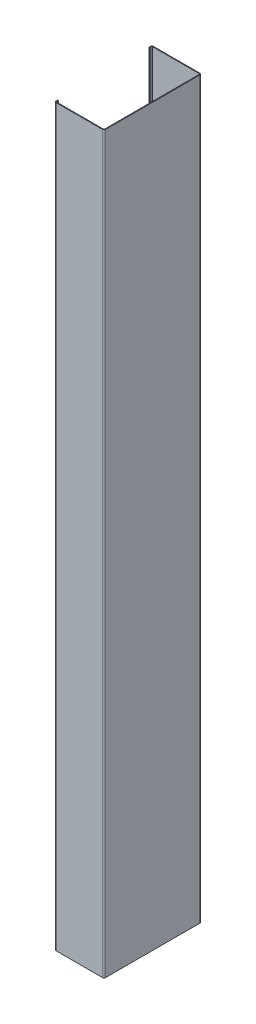
ISO-10303-21;
HEADER;
FILE_DESCRIPTION(('STEP AP214'),'2;1');
FILE_NAME('part.step','',(''),(''),'','','');
FILE_SCHEMA(('AUTOMOTIVE_DESIGN { 1 0 10303 214 1 1 1 1 }'));
ENDSEC;
DATA;
#1=APPLICATION_CONTEXT('core data for automotive mechanical design processes');
#2=APPLICATION_PROTOCOL_DEFINITION('international standard','automotive_design',2000,#1);
#3=PRODUCT_CONTEXT('',#1,'mechanical');
#4=PRODUCT('Part','Part','',(#3));
#5=PRODUCT_RELATED_PRODUCT_CATEGORY('part','',(#4));
#6=PRODUCT_DEFINITION_FORMATION('','',#4);
#7=PRODUCT_DEFINITION_CONTEXT('part definition',#1,'design');
#8=PRODUCT_DEFINITION('design','',#6,#7);
#9=PRODUCT_DEFINITION_SHAPE('','',#8);
#10=(LENGTH_UNIT() NAMED_UNIT(*) SI_UNIT(.MILLI.,.METRE.));
#11=(NAMED_UNIT(*) PLANE_ANGLE_UNIT() SI_UNIT($,.RADIAN.));
#12=(NAMED_UNIT(*) SI_UNIT($,.STERADIAN.) SOLID_ANGLE_UNIT());
#13=UNCERTAINTY_MEASURE_WITH_UNIT(LENGTH_MEASURE(1.E-05),#10,'distance_accuracy_value','');
#14=(GEOMETRIC_REPRESENTATION_CONTEXT(3) GLOBAL_UNCERTAINTY_ASSIGNED_CONTEXT((#13)) GLOBAL_UNIT_ASSIGNED_CONTEXT((#10,
#11,#12)) REPRESENTATION_CONTEXT('',''));
#15=CARTESIAN_POINT('',(0.,0.,0.));
#16=DIRECTION('',(0.,0.,1.));
#17=DIRECTION('',(1.,0.,0.));
#18=AXIS2_PLACEMENT_3D('',#15,#16,#17);
#19=CARTESIAN_POINT('',(-50.,743.,47.75));
#20=DIRECTION('',(0.,1.,0.));
#21=DIRECTION('',(0.,0.,1.));
#22=AXIS2_PLACEMENT_3D('',#19,#20,#21);
#23=PLANE('',#22);
#24=DIRECTION('',(1.,0.,0.));
#25=VECTOR('',#24,1.);
#26=CARTESIAN_POINT('',(-50.,743.,47.75));
#27=LINE('',#26,#25);
#28=CARTESIAN_POINT('',(-50.,743.,47.75));
#29=VERTEX_POINT('',#28);
#30=CARTESIAN_POINT('',(-49.25,743.,47.75));
#31=VERTEX_POINT('',#30);
#32=EDGE_CURVE('E11',#29,#31,#27,.T.);
#33=ORIENTED_EDGE('',*,*,#32,.F.);
#34=CARTESIAN_POINT('',(-48.5,743.,47.75));
#35=DIRECTION('',(0.,-1.,0.));
#36=DIRECTION('',(0.,0.,-1.));
#37=AXIS2_PLACEMENT_3D('',#34,#35,#36);
#38=CIRCLE('',#37,1.5);
#39=CARTESIAN_POINT('',(-48.5,743.,49.25));
#40=VERTEX_POINT('',#39);
#41=EDGE_CURVE('E361',#29,#40,#38,.F.);
#42=ORIENTED_EDGE('',*,*,#41,.T.);
#43=DIRECTION('',(0.,0.,1.));
#44=VECTOR('',#43,1.);
#45=CARTESIAN_POINT('',(-48.5,743.,48.5));
#46=LINE('',#45,#44);
#47=CARTESIAN_POINT('',(-48.5,743.,48.5));
#48=VERTEX_POINT('',#47);
#49=EDGE_CURVE('E44',#48,#40,#46,.T.);
#50=ORIENTED_EDGE('',*,*,#49,.F.);
#51=CARTESIAN_POINT('',(-48.5,743.,47.75));
#52=DIRECTION('',(0.,1.,0.));
#53=DIRECTION('',(1.,0.,0.));
#54=AXIS2_PLACEMENT_3D('',#51,#52,#53);
#55=CIRCLE('',#54,0.75);
#56=EDGE_CURVE('E436',#31,#48,#55,.T.);
#57=ORIENTED_EDGE('',*,*,#56,.F.);
#58=EDGE_LOOP('',(#33,#42,#50,#57));
#59=FACE_BOUND('',#58,.T.);
#60=ADVANCED_FACE('F36',(#59),#23,.T.);
#61=CARTESIAN_POINT('',(-48.5,743.,48.5));
#62=DIRECTION('',(0.,1.,0.));
#63=DIRECTION('',(0.,0.,1.));
#64=AXIS2_PLACEMENT_3D('',#61,#62,#63);
#65=PLANE('',#64);
#66=DIRECTION('',(0.,0.,1.));
#67=VECTOR('',#66,1.);
#68=CARTESIAN_POINT('',(-50.,743.,49.25));
#69=LINE('',#68,#67);
#70=CARTESIAN_POINT('',(-50.,743.,46.25));
#71=VERTEX_POINT('',#70);
#72=EDGE_CURVE('E365',#71,#29,#69,.T.);
#73=ORIENTED_EDGE('',*,*,#72,.T.);
#74=ORIENTED_EDGE('',*,*,#32,.T.);
#75=DIRECTION('',(0.,0.,-1.));
#76=VECTOR('',#75,1.);
#77=CARTESIAN_POINT('',(-49.25,743.,49.25));
#78=LINE('',#77,#76);
#79=CARTESIAN_POINT('',(-49.25,743.,46.25));
#80=VERTEX_POINT('',#79);
#81=EDGE_CURVE('E438',#80,#31,#78,.F.);
#82=ORIENTED_EDGE('',*,*,#81,.F.);
#83=DIRECTION('',(1.,0.,0.));
#84=VECTOR('',#83,1.);
#85=CARTESIAN_POINT('',(-50.,743.,46.25));
#86=LINE('',#85,#84);
#87=EDGE_CURVE('E441',#71,#80,#86,.T.);
#88=ORIENTED_EDGE('',*,*,#87,.F.);
#89=EDGE_LOOP('',(#73,#74,#82,#88));
#90=FACE_BOUND('',#89,.T.);
#91=ADVANCED_FACE('F447',(#90),#65,.T.);
#92=CARTESIAN_POINT('',(-48.5,0.,49.25));
#93=DIRECTION('',(0.,-1.,0.));
#94=DIRECTION('',(0.,0.,-1.));
#95=AXIS2_PLACEMENT_3D('',#92,#93,#94);
#96=PLANE('',#95);
#97=DIRECTION('',(0.,0.,-1.));
#98=VECTOR('',#97,1.);
#99=CARTESIAN_POINT('',(-48.5,0.,49.25));
#100=LINE('',#99,#98);
#101=CARTESIAN_POINT('',(-48.5,0.,49.25));
#102=VERTEX_POINT('',#101);
#103=CARTESIAN_POINT('',(-48.5,0.,48.5));
#104=VERTEX_POINT('',#103);
#105=EDGE_CURVE('E345',#102,#104,#100,.T.);
#106=ORIENTED_EDGE('',*,*,#105,.F.);
#107=CARTESIAN_POINT('',(-48.5,0.,47.75));
#108=DIRECTION('',(0.,-1.,0.));
#109=DIRECTION('',(0.,0.,-1.));
#110=AXIS2_PLACEMENT_3D('',#107,#108,#109);
#111=CIRCLE('',#110,1.5);
#112=CARTESIAN_POINT('',(-50.,0.,47.75));
#113=VERTEX_POINT('',#112);
#114=EDGE_CURVE('E261',#113,#102,#111,.F.);
#115=ORIENTED_EDGE('',*,*,#114,.F.);
#116=DIRECTION('',(-1.,0.,0.));
#117=VECTOR('',#116,1.);
#118=CARTESIAN_POINT('',(-49.25,0.,47.75));
#119=LINE('',#118,#117);
#120=CARTESIAN_POINT('',(-49.25,0.,47.75));
#121=VERTEX_POINT('',#120);
#122=EDGE_CURVE('E343',#121,#113,#119,.T.);
#123=ORIENTED_EDGE('',*,*,#122,.F.);
#124=CARTESIAN_POINT('',(-48.5,0.,47.75));
#125=DIRECTION('',(0.,1.,0.));
#126=DIRECTION('',(1.,0.,0.));
#127=AXIS2_PLACEMENT_3D('',#124,#125,#126);
#128=CIRCLE('',#127,0.75);
#129=EDGE_CURVE('E249',#121,#104,#128,.T.);
#130=ORIENTED_EDGE('',*,*,#129,.T.);
#131=EDGE_LOOP('',(#106,#115,#123,#130));
#132=FACE_BOUND('',#131,.T.);
#133=ADVANCED_FACE('F454',(#132),#96,.T.);
#134=CARTESIAN_POINT('',(-49.25,0.,47.75));
#135=DIRECTION('',(0.,-1.,0.));
#136=DIRECTION('',(0.,0.,-1.));
#137=AXIS2_PLACEMENT_3D('',#134,#135,#136);
#138=PLANE('',#137);
#139=DIRECTION('',(1.,0.,0.));
#140=VECTOR('',#139,1.);
#141=CARTESIAN_POINT('',(0.,0.,49.25));
#142=LINE('',#141,#140);
#143=CARTESIAN_POINT('',(-1.49999999999998,0.,49.25));
#144=VERTEX_POINT('',#143);
#145=EDGE_CURVE('E264',#102,#144,#142,.T.);
#146=ORIENTED_EDGE('',*,*,#145,.F.);
#147=ORIENTED_EDGE('',*,*,#105,.T.);
#148=DIRECTION('',(1.,0.,0.));
#149=VECTOR('',#148,1.);
#150=CARTESIAN_POINT('',(0.,0.,48.5));
#151=LINE('',#150,#149);
#152=CARTESIAN_POINT('',(-1.49999999999998,0.,48.5));
#153=VERTEX_POINT('',#152);
#154=EDGE_CURVE('E246',#104,#153,#151,.T.);
#155=ORIENTED_EDGE('',*,*,#154,.T.);
#156=DIRECTION('',(0.,0.,1.));
#157=VECTOR('',#156,1.);
#158=CARTESIAN_POINT('',(-1.49999999999998,0.,48.5));
#159=LINE('',#158,#157);
#160=EDGE_CURVE('E335',#153,#144,#159,.T.);
#161=ORIENTED_EDGE('',*,*,#160,.T.);
#162=EDGE_LOOP('',(#146,#147,#155,#161));
#163=FACE_BOUND('',#162,.T.);
#164=ADVANCED_FACE('F457',(#163),#138,.T.);
#165=CARTESIAN_POINT('',(-1.49999999999998,743.,49.25));
#166=DIRECTION('',(0.,1.,0.));
#167=DIRECTION('',(0.,0.,1.));
#168=AXIS2_PLACEMENT_3D('',#165,#166,#167);
#169=PLANE('',#168);
#170=DIRECTION('',(0.,0.,-1.));
#171=VECTOR('',#170,1.);
#172=CARTESIAN_POINT('',(-1.49999999999998,743.,49.25));
#173=LINE('',#172,#171);
#174=CARTESIAN_POINT('',(-1.49999999999998,743.,49.25));
#175=VERTEX_POINT('',#174);
#176=CARTESIAN_POINT('',(-1.49999999999998,743.,48.5));
#177=VERTEX_POINT('',#176);
#178=EDGE_CURVE('E341',#175,#177,#173,.T.);
#179=ORIENTED_EDGE('',*,*,#178,.F.);
#180=CARTESIAN_POINT('',(-1.49999999999998,743.,47.75));
#181=DIRECTION('',(0.,-1.,0.));
#182=DIRECTION('',(0.,0.,-1.));
#183=AXIS2_PLACEMENT_3D('',#180,#181,#182);
#184=CIRCLE('',#183,1.5);
#185=CARTESIAN_POINT('',(0.,743.,47.75));
#186=VERTEX_POINT('',#185);
#187=EDGE_CURVE('E373',#175,#186,#184,.F.);
#188=ORIENTED_EDGE('',*,*,#187,.T.);
#189=DIRECTION('',(1.,0.,0.));
#190=VECTOR('',#189,1.);
#191=CARTESIAN_POINT('',(-0.749999999999984,743.,47.75));
#192=LINE('',#191,#190);
#193=CARTESIAN_POINT('',(-0.749999999999984,743.,47.75));
#194=VERTEX_POINT('',#193);
#195=EDGE_CURVE('E339',#194,#186,#192,.T.);
#196=ORIENTED_EDGE('',*,*,#195,.F.);
#197=CARTESIAN_POINT('',(-1.49999999999998,743.,47.75));
#198=DIRECTION('',(0.,1.,0.));
#199=DIRECTION('',(1.,0.,0.));
#200=AXIS2_PLACEMENT_3D('',#197,#198,#199);
#201=CIRCLE('',#200,0.75);
#202=EDGE_CURVE('E432',#177,#194,#201,.T.);
#203=ORIENTED_EDGE('',*,*,#202,.F.);
#204=EDGE_LOOP('',(#179,#188,#196,#203));
#205=FACE_BOUND('',#204,.T.);
#206=ADVANCED_FACE('F477',(#205),#169,.T.);
#207=CARTESIAN_POINT('',(-0.749999999999984,743.,47.75));
#208=DIRECTION('',(0.,1.,0.));
#209=DIRECTION('',(0.,0.,1.));
#210=AXIS2_PLACEMENT_3D('',#207,#208,#209);
#211=PLANE('',#210);
#212=DIRECTION('',(1.,0.,0.));
#213=VECTOR('',#212,1.);
#214=CARTESIAN_POINT('',(0.,743.,49.25));
#215=LINE('',#214,#213);
#216=EDGE_CURVE('E352',#40,#175,#215,.T.);
#217=ORIENTED_EDGE('',*,*,#216,.T.);
#218=ORIENTED_EDGE('',*,*,#178,.T.);
#219=DIRECTION('',(1.,0.,0.));
#220=VECTOR('',#219,1.);
#221=CARTESIAN_POINT('',(0.,743.,48.5));
#222=LINE('',#221,#220);
#223=EDGE_CURVE('E355',#48,#177,#222,.T.);
#224=ORIENTED_EDGE('',*,*,#223,.F.);
#225=ORIENTED_EDGE('',*,*,#49,.T.);
#226=EDGE_LOOP('',(#217,#218,#224,#225));
#227=FACE_BOUND('',#226,.T.);
#228=ADVANCED_FACE('F350',(#227),#211,.T.);
#229=CARTESIAN_POINT('',(0.,0.,47.75));
#230=DIRECTION('',(0.,-1.,0.));
#231=DIRECTION('',(0.,0.,-1.));
#232=AXIS2_PLACEMENT_3D('',#229,#230,#231);
#233=PLANE('',#232);
#234=DIRECTION('',(-1.,0.,0.));
#235=VECTOR('',#234,1.);
#236=CARTESIAN_POINT('',(0.,0.,47.75));
#237=LINE('',#236,#235);
#238=CARTESIAN_POINT('',(0.,0.,47.75));
#239=VERTEX_POINT('',#238);
#240=CARTESIAN_POINT('',(-0.749999999999984,0.,47.75));
#241=VERTEX_POINT('',#240);
#242=EDGE_CURVE('E337',#239,#241,#237,.T.);
#243=ORIENTED_EDGE('',*,*,#242,.F.);
#244=CARTESIAN_POINT('',(-1.49999999999998,0.,47.75));
#245=DIRECTION('',(0.,-1.,0.));
#246=DIRECTION('',(0.,0.,-1.));
#247=AXIS2_PLACEMENT_3D('',#244,#245,#246);
#248=CIRCLE('',#247,1.5);
#249=EDGE_CURVE('E267',#144,#239,#248,.F.);
#250=ORIENTED_EDGE('',*,*,#249,.F.);
#251=ORIENTED_EDGE('',*,*,#160,.F.);
#252=CARTESIAN_POINT('',(-1.49999999999998,0.,47.75));
#253=DIRECTION('',(0.,1.,0.));
#254=DIRECTION('',(1.,0.,0.));
#255=AXIS2_PLACEMENT_3D('',#252,#253,#254);
#256=CIRCLE('',#255,0.75);
#257=EDGE_CURVE('E243',#153,#241,#256,.T.);
#258=ORIENTED_EDGE('',*,*,#257,.T.);
#259=EDGE_LOOP('',(#243,#250,#251,#258));
#260=FACE_BOUND('',#259,.T.);
#261=ADVANCED_FACE('F471',(#260),#233,.T.);
#262=CARTESIAN_POINT('',(-1.49999999999998,0.,48.5));
#263=DIRECTION('',(0.,-1.,0.));
#264=DIRECTION('',(0.,0.,-1.));
#265=AXIS2_PLACEMENT_3D('',#262,#263,#264);
#266=PLANE('',#265);
#267=DIRECTION('',(0.,0.,-1.));
#268=VECTOR('',#267,1.);
#269=CARTESIAN_POINT('',(0.,0.,-49.25));
#270=LINE('',#269,#268);
#271=CARTESIAN_POINT('',(0.,0.,-47.75));
#272=VERTEX_POINT('',#271);
#273=EDGE_CURVE('E270',#239,#272,#270,.T.);
#274=ORIENTED_EDGE('',*,*,#273,.F.);
#275=ORIENTED_EDGE('',*,*,#242,.T.);
#276=DIRECTION('',(0.,0.,-1.));
#277=VECTOR('',#276,1.);
#278=CARTESIAN_POINT('',(-0.750000000000038,0.,-49.25));
#279=LINE('',#278,#277);
#280=CARTESIAN_POINT('',(-0.750000000000037,0.,-47.75));
#281=VERTEX_POINT('',#280);
#282=EDGE_CURVE('E240',#241,#281,#279,.T.);
#283=ORIENTED_EDGE('',*,*,#282,.T.);
#284=DIRECTION('',(1.,0.,0.));
#285=VECTOR('',#284,1.);
#286=CARTESIAN_POINT('',(-0.750000000000037,0.,-47.75));
#287=LINE('',#286,#285);
#288=EDGE_CURVE('E331',#281,#272,#287,.T.);
#289=ORIENTED_EDGE('',*,*,#288,.T.);
#290=EDGE_LOOP('',(#274,#275,#283,#289));
#291=FACE_BOUND('',#290,.T.);
#292=ADVANCED_FACE('F481',(#291),#266,.T.);
#293=CARTESIAN_POINT('',(0.,743.,-47.75));
#294=DIRECTION('',(0.,1.,0.));
#295=DIRECTION('',(0.,0.,1.));
#296=AXIS2_PLACEMENT_3D('',#293,#294,#295);
#297=PLANE('',#296);
#298=DIRECTION('',(-1.,0.,0.));
#299=VECTOR('',#298,1.);
#300=CARTESIAN_POINT('',(0.,743.,-47.75));
#301=LINE('',#300,#299);
#302=CARTESIAN_POINT('',(0.,743.,-47.75));
#303=VERTEX_POINT('',#302);
#304=CARTESIAN_POINT('',(-0.750000000000037,743.,-47.75));
#305=VERTEX_POINT('',#304);
#306=EDGE_CURVE('E193',#303,#305,#301,.T.);
#307=ORIENTED_EDGE('',*,*,#306,.F.);
#308=CARTESIAN_POINT('',(-1.50000000000004,743.,-47.75));
#309=DIRECTION('',(0.,-1.,0.));
#310=DIRECTION('',(0.,0.,-1.));
#311=AXIS2_PLACEMENT_3D('',#308,#309,#310);
#312=CIRCLE('',#311,1.5);
#313=CARTESIAN_POINT('',(-1.50000000000004,743.,-49.25));
#314=VERTEX_POINT('',#313);
#315=EDGE_CURVE('E197',#303,#314,#312,.F.);
#316=ORIENTED_EDGE('',*,*,#315,.T.);
#317=DIRECTION('',(0.,0.,-1.));
#318=VECTOR('',#317,1.);
#319=CARTESIAN_POINT('',(-1.50000000000004,743.,-48.5));
#320=LINE('',#319,#318);
#321=CARTESIAN_POINT('',(-1.50000000000004,743.,-48.5));
#322=VERTEX_POINT('',#321);
#323=EDGE_CURVE('E181',#322,#314,#320,.T.);
#324=ORIENTED_EDGE('',*,*,#323,.F.);
#325=CARTESIAN_POINT('',(-1.50000000000004,743.,-47.75));
#326=DIRECTION('',(0.,1.,0.));
#327=DIRECTION('',(1.,0.,0.));
#328=AXIS2_PLACEMENT_3D('',#325,#326,#327);
#329=CIRCLE('',#328,0.75);
#330=EDGE_CURVE('E394',#305,#322,#329,.T.);
#331=ORIENTED_EDGE('',*,*,#330,.F.);
#332=EDGE_LOOP('',(#307,#316,#324,#331));
#333=FACE_BOUND('',#332,.T.);
#334=ADVANCED_FACE('F199',(#333),#297,.T.);
#335=CARTESIAN_POINT('',(-1.50000000000004,743.,-48.5));
#336=DIRECTION('',(0.,1.,0.));
#337=DIRECTION('',(0.,0.,1.));
#338=AXIS2_PLACEMENT_3D('',#335,#336,#337);
#339=PLANE('',#338);
#340=DIRECTION('',(0.,0.,-1.));
#341=VECTOR('',#340,1.);
#342=CARTESIAN_POINT('',(0.,743.,-49.25));
#343=LINE('',#342,#341);
#344=EDGE_CURVE('E203',#186,#303,#343,.T.);
#345=ORIENTED_EDGE('',*,*,#344,.T.);
#346=ORIENTED_EDGE('',*,*,#306,.T.);
#347=DIRECTION('',(0.,0.,-1.));
#348=VECTOR('',#347,1.);
#349=CARTESIAN_POINT('',(-0.750000000000038,743.,-49.25));
#350=LINE('',#349,#348);
#351=EDGE_CURVE('E429',#194,#305,#350,.T.);
#352=ORIENTED_EDGE('',*,*,#351,.F.);
#353=ORIENTED_EDGE('',*,*,#195,.T.);
#354=EDGE_LOOP('',(#345,#346,#352,#353));
#355=FACE_BOUND('',#354,.T.);
#356=ADVANCED_FACE('F381',(#355),#339,.T.);
#357=CARTESIAN_POINT('',(-1.50000000000004,0.,-49.25));
#358=DIRECTION('',(0.,-1.,0.));
#359=DIRECTION('',(0.,0.,-1.));
#360=AXIS2_PLACEMENT_3D('',#357,#358,#359);
#361=PLANE('',#360);
#362=DIRECTION('',(0.,0.,1.));
#363=VECTOR('',#362,1.);
#364=CARTESIAN_POINT('',(-1.50000000000004,0.,-49.25));
#365=LINE('',#364,#363);
#366=CARTESIAN_POINT('',(-1.50000000000004,0.,-49.25));
#367=VERTEX_POINT('',#366);
#368=CARTESIAN_POINT('',(-1.50000000000004,0.,-48.5));
#369=VERTEX_POINT('',#368);
#370=EDGE_CURVE('E194',#367,#369,#365,.T.);
#371=ORIENTED_EDGE('',*,*,#370,.F.);
#372=CARTESIAN_POINT('',(-1.50000000000004,0.,-47.75));
#373=DIRECTION('',(0.,-1.,0.));
#374=DIRECTION('',(0.,0.,-1.));
#375=AXIS2_PLACEMENT_3D('',#372,#373,#374);
#376=CIRCLE('',#375,1.5);
#377=EDGE_CURVE('E210',#272,#367,#376,.F.);
#378=ORIENTED_EDGE('',*,*,#377,.F.);
#379=ORIENTED_EDGE('',*,*,#288,.F.);
#380=CARTESIAN_POINT('',(-1.50000000000004,0.,-47.75));
#381=DIRECTION('',(0.,1.,0.));
#382=DIRECTION('',(1.,0.,0.));
#383=AXIS2_PLACEMENT_3D('',#380,#381,#382);
#384=CIRCLE('',#383,0.75);
#385=EDGE_CURVE('E237',#281,#369,#384,.T.);
#386=ORIENTED_EDGE('',*,*,#385,.T.);
#387=EDGE_LOOP('',(#371,#378,#379,#386));
#388=FACE_BOUND('',#387,.T.);
#389=ADVANCED_FACE('F388',(#388),#361,.T.);
#390=CARTESIAN_POINT('',(-0.750000000000037,0.,-47.75));
#391=DIRECTION('',(0.,-1.,0.));
#392=DIRECTION('',(0.,0.,-1.));
#393=AXIS2_PLACEMENT_3D('',#390,#391,#392);
#394=PLANE('',#393);
#395=DIRECTION('',(-1.,0.,0.));
#396=VECTOR('',#395,1.);
#397=CARTESIAN_POINT('',(-50.,0.,-49.25));
#398=LINE('',#397,#396);
#399=CARTESIAN_POINT('',(-48.5,0.,-49.25));
#400=VERTEX_POINT('',#399);
#401=EDGE_CURVE('E274',#367,#400,#398,.T.);
#402=ORIENTED_EDGE('',*,*,#401,.F.);
#403=ORIENTED_EDGE('',*,*,#370,.T.);
#404=DIRECTION('',(1.,0.,0.));
#405=VECTOR('',#404,1.);
#406=CARTESIAN_POINT('',(-50.,0.,-48.5));
#407=LINE('',#406,#405);
#408=CARTESIAN_POINT('',(-48.5,0.,-48.5));
#409=VERTEX_POINT('',#408);
#410=EDGE_CURVE('E235',#369,#409,#407,.F.);
#411=ORIENTED_EDGE('',*,*,#410,.T.);
#412=DIRECTION('',(0.,0.,-1.));
#413=VECTOR('',#412,1.);
#414=CARTESIAN_POINT('',(-48.5,0.,-48.5));
#415=LINE('',#414,#413);
#416=EDGE_CURVE('E117',#409,#400,#415,.T.);
#417=ORIENTED_EDGE('',*,*,#416,.T.);
#418=EDGE_LOOP('',(#402,#403,#411,#417));
#419=FACE_BOUND('',#418,.T.);
#420=ADVANCED_FACE('F390',(#419),#394,.T.);
#421=CARTESIAN_POINT('',(-48.5,743.,-49.25));
#422=DIRECTION('',(0.,1.,0.));
#423=DIRECTION('',(0.,0.,1.));
#424=AXIS2_PLACEMENT_3D('',#421,#422,#423);
#425=PLANE('',#424);
#426=DIRECTION('',(0.,0.,1.));
#427=VECTOR('',#426,1.);
#428=CARTESIAN_POINT('',(-48.5,743.,-49.25));
#429=LINE('',#428,#427);
#430=CARTESIAN_POINT('',(-48.5,743.,-49.25));
#431=VERTEX_POINT('',#430);
#432=CARTESIAN_POINT('',(-48.5,743.,-48.5));
#433=VERTEX_POINT('',#432);
#434=EDGE_CURVE('E329',#431,#433,#429,.T.);
#435=ORIENTED_EDGE('',*,*,#434,.F.);
#436=CARTESIAN_POINT('',(-48.5,743.,-47.75));
#437=DIRECTION('',(0.,-1.,0.));
#438=DIRECTION('',(0.,0.,-1.));
#439=AXIS2_PLACEMENT_3D('',#436,#437,#438);
#440=CIRCLE('',#439,1.5);
#441=CARTESIAN_POINT('',(-50.,743.,-47.75));
#442=VERTEX_POINT('',#441);
#443=EDGE_CURVE('E218',#431,#442,#440,.F.);
#444=ORIENTED_EDGE('',*,*,#443,.T.);
#445=DIRECTION('',(-1.,0.,0.));
#446=VECTOR('',#445,1.);
#447=CARTESIAN_POINT('',(-49.25,743.,-47.75));
#448=LINE('',#447,#446);
#449=CARTESIAN_POINT('',(-49.25,743.,-47.75));
#450=VERTEX_POINT('',#449);
#451=EDGE_CURVE('E52',#450,#442,#448,.T.);
#452=ORIENTED_EDGE('',*,*,#451,.F.);
#453=CARTESIAN_POINT('',(-48.5,743.,-47.75));
#454=DIRECTION('',(0.,1.,0.));
#455=DIRECTION('',(1.,0.,0.));
#456=AXIS2_PLACEMENT_3D('',#453,#454,#455);
#457=CIRCLE('',#456,0.75);
#458=EDGE_CURVE('E422',#433,#450,#457,.T.);
#459=ORIENTED_EDGE('',*,*,#458,.F.);
#460=EDGE_LOOP('',(#435,#444,#452,#459));
#461=FACE_BOUND('',#460,.T.);
#462=ADVANCED_FACE('F552',(#461),#425,.T.);
#463=CARTESIAN_POINT('',(-49.25,743.,-47.75));
#464=DIRECTION('',(0.,1.,0.));
#465=DIRECTION('',(0.,0.,1.));
#466=AXIS2_PLACEMENT_3D('',#463,#464,#465);
#467=PLANE('',#466);
#468=DIRECTION('',(-1.,0.,0.));
#469=VECTOR('',#468,1.);
#470=CARTESIAN_POINT('',(-50.,743.,-49.25));
#471=LINE('',#470,#469);
#472=EDGE_CURVE('E185',#314,#431,#471,.T.);
#473=ORIENTED_EDGE('',*,*,#472,.T.);
#474=ORIENTED_EDGE('',*,*,#434,.T.);
#475=DIRECTION('',(1.,0.,0.));
#476=VECTOR('',#475,1.);
#477=CARTESIAN_POINT('',(-50.,743.,-48.5));
#478=LINE('',#477,#476);
#479=EDGE_CURVE('E188',#322,#433,#478,.F.);
#480=ORIENTED_EDGE('',*,*,#479,.F.);
#481=ORIENTED_EDGE('',*,*,#323,.T.);
#482=EDGE_LOOP('',(#473,#474,#480,#481));
#483=FACE_BOUND('',#482,.T.);
#484=ADVANCED_FACE('F183',(#483),#467,.T.);
#485=CARTESIAN_POINT('',(-50.,0.,-47.75));
#486=DIRECTION('',(0.,-1.,0.));
#487=DIRECTION('',(0.,0.,-1.));
#488=AXIS2_PLACEMENT_3D('',#485,#486,#487);
#489=PLANE('',#488);
#490=DIRECTION('',(1.,0.,0.));
#491=VECTOR('',#490,1.);
#492=CARTESIAN_POINT('',(-50.,0.,-47.75));
#493=LINE('',#492,#491);
#494=CARTESIAN_POINT('',(-50.,0.,-47.75));
#495=VERTEX_POINT('',#494);
#496=CARTESIAN_POINT('',(-49.25,0.,-47.75));
#497=VERTEX_POINT('',#496);
#498=EDGE_CURVE('E124',#495,#497,#493,.T.);
#499=ORIENTED_EDGE('',*,*,#498,.F.);
#500=CARTESIAN_POINT('',(-48.5,0.,-47.75));
#501=DIRECTION('',(0.,-1.,0.));
#502=DIRECTION('',(0.,0.,-1.));
#503=AXIS2_PLACEMENT_3D('',#500,#501,#502);
#504=CIRCLE('',#503,1.5);
#505=EDGE_CURVE('E276',#400,#495,#504,.F.);
#506=ORIENTED_EDGE('',*,*,#505,.F.);
#507=ORIENTED_EDGE('',*,*,#416,.F.);
#508=CARTESIAN_POINT('',(-48.5,0.,-47.75));
#509=DIRECTION('',(0.,1.,0.));
#510=DIRECTION('',(1.,0.,0.));
#511=AXIS2_PLACEMENT_3D('',#508,#509,#510);
#512=CIRCLE('',#511,0.75);
#513=EDGE_CURVE('E233',#409,#497,#512,.T.);
#514=ORIENTED_EDGE('',*,*,#513,.T.);
#515=EDGE_LOOP('',(#499,#506,#507,#514));
#516=FACE_BOUND('',#515,.T.);
#517=ADVANCED_FACE('F405',(#516),#489,.T.);
#518=CARTESIAN_POINT('',(-48.5,0.,-48.5));
#519=DIRECTION('',(0.,-1.,0.));
#520=DIRECTION('',(0.,0.,-1.));
#521=AXIS2_PLACEMENT_3D('',#518,#519,#520);
#522=PLANE('',#521);
#523=DIRECTION('',(0.,0.,1.));
#524=VECTOR('',#523,1.);
#525=CARTESIAN_POINT('',(-50.,0.,-49.25));
#526=LINE('',#525,#524);
#527=CARTESIAN_POINT('',(-50.,0.,-46.25));
#528=VERTEX_POINT('',#527);
#529=EDGE_CURVE('E224',#495,#528,#526,.T.);
#530=ORIENTED_EDGE('',*,*,#529,.F.);
#531=ORIENTED_EDGE('',*,*,#498,.T.);
#532=DIRECTION('',(0.,0.,-1.));
#533=VECTOR('',#532,1.);
#534=CARTESIAN_POINT('',(-49.25,0.,-49.25));
#535=LINE('',#534,#533);
#536=CARTESIAN_POINT('',(-49.25,0.,-46.25));
#537=VERTEX_POINT('',#536);
#538=EDGE_CURVE('E230',#497,#537,#535,.F.);
#539=ORIENTED_EDGE('',*,*,#538,.T.);
#540=DIRECTION('',(-1.,0.,0.));
#541=VECTOR('',#540,1.);
#542=CARTESIAN_POINT('',(-49.25,0.,-46.25));
#543=LINE('',#542,#541);
#544=EDGE_CURVE('E227',#537,#528,#543,.T.);
#545=ORIENTED_EDGE('',*,*,#544,.T.);
#546=EDGE_LOOP('',(#530,#531,#539,#545));
#547=FACE_BOUND('',#546,.T.);
#548=ADVANCED_FACE('F413',(#547),#522,.T.);
#549=CARTESIAN_POINT('',(-50.,743.,-49.25));
#550=DIRECTION('',(1.,0.,0.));
#551=DIRECTION('',(0.,0.,-1.));
#552=AXIS2_PLACEMENT_3D('',#549,#550,#551);
#553=PLANE('',#552);
#554=ORIENTED_EDGE('',*,*,#529,.T.);
#555=DIRECTION('',(0.,-1.,0.));
#556=VECTOR('',#555,1.);
#557=CARTESIAN_POINT('',(-50.,743.,-46.25));
#558=LINE('',#557,#556);
#559=CARTESIAN_POINT('',(-50.,743.,-46.25));
#560=VERTEX_POINT('',#559);
#561=EDGE_CURVE('E324',#560,#528,#558,.T.);
#562=ORIENTED_EDGE('',*,*,#561,.F.);
#563=DIRECTION('',(0.,0.,1.));
#564=VECTOR('',#563,1.);
#565=CARTESIAN_POINT('',(-50.,743.,-49.25));
#566=LINE('',#565,#564);
#567=EDGE_CURVE('E130',#442,#560,#566,.T.);
#568=ORIENTED_EDGE('',*,*,#567,.F.);
#569=DIRECTION('',(0.,-1.,0.));
#570=VECTOR('',#569,1.);
#571=CARTESIAN_POINT('',(-50.,743.,-47.75));
#572=LINE('',#571,#570);
#573=EDGE_CURVE('E220',#442,#495,#572,.T.);
#574=ORIENTED_EDGE('',*,*,#573,.T.);
#575=EDGE_LOOP('',(#554,#562,#568,#574));
#576=FACE_BOUND('',#575,.T.);
#577=ADVANCED_FACE('F411',(#576),#553,.F.);
#578=CARTESIAN_POINT('',(-49.25,743.,-46.25));
#579=DIRECTION('',(0.,0.,1.));
#580=DIRECTION('',(1.,0.,0.));
#581=AXIS2_PLACEMENT_3D('',#578,#579,#580);
#582=PLANE('',#581);
#583=ORIENTED_EDGE('',*,*,#544,.F.);
#584=DIRECTION('',(0.,-1.,0.));
#585=VECTOR('',#584,1.);
#586=CARTESIAN_POINT('',(-49.25,743.,-46.25));
#587=LINE('',#586,#585);
#588=CARTESIAN_POINT('',(-49.25,743.,-46.25));
#589=VERTEX_POINT('',#588);
#590=EDGE_CURVE('E322',#589,#537,#587,.T.);
#591=ORIENTED_EDGE('',*,*,#590,.F.);
#592=DIRECTION('',(-1.,0.,0.));
#593=VECTOR('',#592,1.);
#594=CARTESIAN_POINT('',(-49.25,743.,-46.25));
#595=LINE('',#594,#593);
#596=EDGE_CURVE('E418',#589,#560,#595,.T.);
#597=ORIENTED_EDGE('',*,*,#596,.T.);
#598=ORIENTED_EDGE('',*,*,#561,.T.);
#599=EDGE_LOOP('',(#583,#591,#597,#598));
#600=FACE_BOUND('',#599,.T.);
#601=ADVANCED_FACE('F416',(#600),#582,.T.);
#602=CARTESIAN_POINT('',(-49.25,743.,-49.25));
#603=DIRECTION('',(1.,0.,0.));
#604=DIRECTION('',(0.,0.,-1.));
#605=AXIS2_PLACEMENT_3D('',#602,#603,#604);
#606=PLANE('',#605);
#607=ORIENTED_EDGE('',*,*,#538,.F.);
#608=DIRECTION('',(0.,-1.,0.));
#609=VECTOR('',#608,1.);
#610=CARTESIAN_POINT('',(-49.25,743.,-47.75));
#611=LINE('',#610,#609);
#612=EDGE_CURVE('E319',#450,#497,#611,.T.);
#613=ORIENTED_EDGE('',*,*,#612,.F.);
#614=DIRECTION('',(0.,0.,-1.));
#615=VECTOR('',#614,1.);
#616=CARTESIAN_POINT('',(-49.25,743.,-49.25));
#617=LINE('',#616,#615);
#618=EDGE_CURVE('E420',#450,#589,#617,.F.);
#619=ORIENTED_EDGE('',*,*,#618,.T.);
#620=ORIENTED_EDGE('',*,*,#590,.T.);
#621=EDGE_LOOP('',(#607,#613,#619,#620));
#622=FACE_BOUND('',#621,.T.);
#623=ADVANCED_FACE('F608',(#622),#606,.T.);
#624=CARTESIAN_POINT('',(-48.5,743.,-47.75));
#625=DIRECTION('',(0.,-1.,0.));
#626=DIRECTION('',(0.,0.,-1.));
#627=AXIS2_PLACEMENT_3D('',#624,#625,#626);
#628=CYLINDRICAL_SURFACE('',#627,0.75);
#629=ORIENTED_EDGE('',*,*,#513,.F.);
#630=DIRECTION('',(0.,-1.,0.));
#631=VECTOR('',#630,1.);
#632=CARTESIAN_POINT('',(-48.5,743.,-48.5));
#633=LINE('',#632,#631);
#634=EDGE_CURVE('E316',#433,#409,#633,.T.);
#635=ORIENTED_EDGE('',*,*,#634,.F.);
#636=ORIENTED_EDGE('',*,*,#458,.T.);
#637=ORIENTED_EDGE('',*,*,#612,.T.);
#638=EDGE_LOOP('',(#629,#635,#636,#637));
#639=FACE_BOUND('',#638,.T.);
#640=ADVANCED_FACE('F402',(#639),#628,.F.);
#641=CARTESIAN_POINT('',(-50.,743.,-48.5));
#642=DIRECTION('',(0.,0.,1.));
#643=DIRECTION('',(1.,0.,0.));
#644=AXIS2_PLACEMENT_3D('',#641,#642,#643);
#645=PLANE('',#644);
#646=ORIENTED_EDGE('',*,*,#410,.F.);
#647=DIRECTION('',(0.,-1.,0.));
#648=VECTOR('',#647,1.);
#649=CARTESIAN_POINT('',(-1.50000000000004,743.,-48.5));
#650=LINE('',#649,#648);
#651=EDGE_CURVE('E313',#322,#369,#650,.T.);
#652=ORIENTED_EDGE('',*,*,#651,.F.);
#653=ORIENTED_EDGE('',*,*,#479,.T.);
#654=ORIENTED_EDGE('',*,*,#634,.T.);
#655=EDGE_LOOP('',(#646,#652,#653,#654));
#656=FACE_BOUND('',#655,.T.);
#657=ADVANCED_FACE('F396',(#656),#645,.T.);
#658=CARTESIAN_POINT('',(-1.50000000000004,743.,-47.75));
#659=DIRECTION('',(0.,-1.,0.));
#660=DIRECTION('',(0.,0.,-1.));
#661=AXIS2_PLACEMENT_3D('',#658,#659,#660);
#662=CYLINDRICAL_SURFACE('',#661,0.75);
#663=ORIENTED_EDGE('',*,*,#385,.F.);
#664=DIRECTION('',(0.,-1.,0.));
#665=VECTOR('',#664,1.);
#666=CARTESIAN_POINT('',(-0.750000000000037,743.,-47.75));
#667=LINE('',#666,#665);
#668=EDGE_CURVE('E310',#305,#281,#667,.T.);
#669=ORIENTED_EDGE('',*,*,#668,.F.);
#670=ORIENTED_EDGE('',*,*,#330,.T.);
#671=ORIENTED_EDGE('',*,*,#651,.T.);
#672=EDGE_LOOP('',(#663,#669,#670,#671));
#673=FACE_BOUND('',#672,.T.);
#674=ADVANCED_FACE('F393',(#673),#662,.F.);
#675=CARTESIAN_POINT('',(-0.750000000000038,743.,-49.25));
#676=DIRECTION('',(-1.,0.,0.));
#677=DIRECTION('',(0.,0.,1.));
#678=AXIS2_PLACEMENT_3D('',#675,#676,#677);
#679=PLANE('',#678);
#680=ORIENTED_EDGE('',*,*,#282,.F.);
#681=DIRECTION('',(0.,-1.,0.));
#682=VECTOR('',#681,1.);
#683=CARTESIAN_POINT('',(-0.749999999999984,743.,47.75));
#684=LINE('',#683,#682);
#685=EDGE_CURVE('E307',#194,#241,#684,.T.);
#686=ORIENTED_EDGE('',*,*,#685,.F.);
#687=ORIENTED_EDGE('',*,*,#351,.T.);
#688=ORIENTED_EDGE('',*,*,#668,.T.);
#689=EDGE_LOOP('',(#680,#686,#687,#688));
#690=FACE_BOUND('',#689,.T.);
#691=ADVANCED_FACE('F479',(#690),#679,.T.);
#692=CARTESIAN_POINT('',(-1.49999999999998,743.,47.75));
#693=DIRECTION('',(0.,-1.,0.));
#694=DIRECTION('',(0.,0.,-1.));
#695=AXIS2_PLACEMENT_3D('',#692,#693,#694);
#696=CYLINDRICAL_SURFACE('',#695,0.75);
#697=ORIENTED_EDGE('',*,*,#257,.F.);
#698=DIRECTION('',(0.,-1.,0.));
#699=VECTOR('',#698,1.);
#700=CARTESIAN_POINT('',(-1.49999999999998,743.,48.5));
#701=LINE('',#700,#699);
#702=EDGE_CURVE('E304',#177,#153,#701,.T.);
#703=ORIENTED_EDGE('',*,*,#702,.F.);
#704=ORIENTED_EDGE('',*,*,#202,.T.);
#705=ORIENTED_EDGE('',*,*,#685,.T.);
#706=EDGE_LOOP('',(#697,#703,#704,#705));
#707=FACE_BOUND('',#706,.T.);
#708=ADVANCED_FACE('F467',(#707),#696,.F.);
#709=CARTESIAN_POINT('',(0.,743.,48.5));
#710=DIRECTION('',(0.,0.,-1.));
#711=DIRECTION('',(-1.,0.,0.));
#712=AXIS2_PLACEMENT_3D('',#709,#710,#711);
#713=PLANE('',#712);
#714=ORIENTED_EDGE('',*,*,#154,.F.);
#715=DIRECTION('',(0.,-1.,0.));
#716=VECTOR('',#715,1.);
#717=CARTESIAN_POINT('',(-48.5,743.,48.5));
#718=LINE('',#717,#716);
#719=EDGE_CURVE('E301',#48,#104,#718,.T.);
#720=ORIENTED_EDGE('',*,*,#719,.F.);
#721=ORIENTED_EDGE('',*,*,#223,.T.);
#722=ORIENTED_EDGE('',*,*,#702,.T.);
#723=EDGE_LOOP('',(#714,#720,#721,#722));
#724=FACE_BOUND('',#723,.T.);
#725=ADVANCED_FACE('F462',(#724),#713,.T.);
#726=CARTESIAN_POINT('',(-48.5,743.,47.75));
#727=DIRECTION('',(0.,-1.,0.));
#728=DIRECTION('',(0.,0.,-1.));
#729=AXIS2_PLACEMENT_3D('',#726,#727,#728);
#730=CYLINDRICAL_SURFACE('',#729,0.75);
#731=ORIENTED_EDGE('',*,*,#129,.F.);
#732=DIRECTION('',(0.,-1.,0.));
#733=VECTOR('',#732,1.);
#734=CARTESIAN_POINT('',(-49.25,743.,47.75));
#735=LINE('',#734,#733);
#736=EDGE_CURVE('E298',#31,#121,#735,.T.);
#737=ORIENTED_EDGE('',*,*,#736,.F.);
#738=ORIENTED_EDGE('',*,*,#56,.T.);
#739=ORIENTED_EDGE('',*,*,#719,.T.);
#740=EDGE_LOOP('',(#731,#737,#738,#739));
#741=FACE_BOUND('',#740,.T.);
#742=ADVANCED_FACE('F460',(#741),#730,.F.);
#743=CARTESIAN_POINT('',(-49.25,743.,49.25));
#744=DIRECTION('',(1.,0.,0.));
#745=DIRECTION('',(0.,0.,-1.));
#746=AXIS2_PLACEMENT_3D('',#743,#744,#745);
#747=PLANE('',#746);
#748=DIRECTION('',(0.,0.,-1.));
#749=VECTOR('',#748,1.);
#750=CARTESIAN_POINT('',(-49.25,0.,49.25));
#751=LINE('',#750,#749);
#752=CARTESIAN_POINT('',(-49.25,0.,46.25));
#753=VERTEX_POINT('',#752);
#754=EDGE_CURVE('E252',#753,#121,#751,.F.);
#755=ORIENTED_EDGE('',*,*,#754,.F.);
#756=DIRECTION('',(0.,-1.,0.));
#757=VECTOR('',#756,1.);
#758=CARTESIAN_POINT('',(-49.25,743.,46.25));
#759=LINE('',#758,#757);
#760=EDGE_CURVE('E296',#80,#753,#759,.T.);
#761=ORIENTED_EDGE('',*,*,#760,.F.);
#762=ORIENTED_EDGE('',*,*,#81,.T.);
#763=ORIENTED_EDGE('',*,*,#736,.T.);
#764=EDGE_LOOP('',(#755,#761,#762,#763));
#765=FACE_BOUND('',#764,.T.);
#766=ADVANCED_FACE('F682',(#765),#747,.T.);
#767=CARTESIAN_POINT('',(-50.,743.,46.25));
#768=DIRECTION('',(0.,0.,-1.));
#769=DIRECTION('',(-1.,0.,0.));
#770=AXIS2_PLACEMENT_3D('',#767,#768,#769);
#771=PLANE('',#770);
#772=DIRECTION('',(1.,0.,0.));
#773=VECTOR('',#772,1.);
#774=CARTESIAN_POINT('',(-50.,0.,46.25));
#775=LINE('',#774,#773);
#776=CARTESIAN_POINT('',(-50.,0.,46.25));
#777=VERTEX_POINT('',#776);
#778=EDGE_CURVE('E255',#777,#753,#775,.T.);
#779=ORIENTED_EDGE('',*,*,#778,.F.);
#780=DIRECTION('',(0.,-1.,0.));
#781=VECTOR('',#780,1.);
#782=CARTESIAN_POINT('',(-50.,743.,46.25));
#783=LINE('',#782,#781);
#784=EDGE_CURVE('E294',#71,#777,#783,.T.);
#785=ORIENTED_EDGE('',*,*,#784,.F.);
#786=ORIENTED_EDGE('',*,*,#87,.T.);
#787=ORIENTED_EDGE('',*,*,#760,.T.);
#788=EDGE_LOOP('',(#779,#785,#786,#787));
#789=FACE_BOUND('',#788,.T.);
#790=ADVANCED_FACE('F692',(#789),#771,.T.);
#791=CARTESIAN_POINT('',(-50.,743.,49.25));
#792=DIRECTION('',(1.,0.,0.));
#793=DIRECTION('',(0.,0.,-1.));
#794=AXIS2_PLACEMENT_3D('',#791,#792,#793);
#795=PLANE('',#794);
#796=DIRECTION('',(0.,0.,1.));
#797=VECTOR('',#796,1.);
#798=CARTESIAN_POINT('',(-50.,0.,49.25));
#799=LINE('',#798,#797);
#800=EDGE_CURVE('E258',#777,#113,#799,.T.);
#801=ORIENTED_EDGE('',*,*,#800,.T.);
#802=DIRECTION('',(0.,-1.,0.));
#803=VECTOR('',#802,1.);
#804=CARTESIAN_POINT('',(-50.,743.,47.75));
#805=LINE('',#804,#803);
#806=EDGE_CURVE('E291',#29,#113,#805,.T.);
#807=ORIENTED_EDGE('',*,*,#806,.F.);
#808=ORIENTED_EDGE('',*,*,#72,.F.);
#809=ORIENTED_EDGE('',*,*,#784,.T.);
#810=EDGE_LOOP('',(#801,#807,#808,#809));
#811=FACE_BOUND('',#810,.T.);
#812=ADVANCED_FACE('F451',(#811),#795,.F.);
#813=CARTESIAN_POINT('',(-48.5,743.,47.75));
#814=DIRECTION('',(0.,-1.,0.));
#815=DIRECTION('',(0.,0.,-1.));
#816=AXIS2_PLACEMENT_3D('',#813,#814,#815);
#817=CYLINDRICAL_SURFACE('',#816,1.5);
#818=ORIENTED_EDGE('',*,*,#114,.T.);
#819=DIRECTION('',(0.,-1.,0.));
#820=VECTOR('',#819,1.);
#821=CARTESIAN_POINT('',(-48.5,743.,49.25));
#822=LINE('',#821,#820);
#823=EDGE_CURVE('E288',#40,#102,#822,.T.);
#824=ORIENTED_EDGE('',*,*,#823,.F.);
#825=ORIENTED_EDGE('',*,*,#41,.F.);
#826=ORIENTED_EDGE('',*,*,#806,.T.);
#827=EDGE_LOOP('',(#818,#824,#825,#826));
#828=FACE_BOUND('',#827,.T.);
#829=ADVANCED_FACE('F367',(#828),#817,.T.);
#830=CARTESIAN_POINT('',(0.,743.,49.25));
#831=DIRECTION('',(0.,0.,-1.));
#832=DIRECTION('',(-1.,0.,0.));
#833=AXIS2_PLACEMENT_3D('',#830,#831,#832);
#834=PLANE('',#833);
#835=ORIENTED_EDGE('',*,*,#145,.T.);
#836=DIRECTION('',(0.,-1.,0.));
#837=VECTOR('',#836,1.);
#838=CARTESIAN_POINT('',(-1.49999999999998,743.,49.25));
#839=LINE('',#838,#837);
#840=EDGE_CURVE('E285',#175,#144,#839,.T.);
#841=ORIENTED_EDGE('',*,*,#840,.F.);
#842=ORIENTED_EDGE('',*,*,#216,.F.);
#843=ORIENTED_EDGE('',*,*,#823,.T.);
#844=EDGE_LOOP('',(#835,#841,#842,#843));
#845=FACE_BOUND('',#844,.T.);
#846=ADVANCED_FACE('F371',(#845),#834,.F.);
#847=CARTESIAN_POINT('',(-1.49999999999998,743.,47.75));
#848=DIRECTION('',(0.,-1.,0.));
#849=DIRECTION('',(0.,0.,-1.));
#850=AXIS2_PLACEMENT_3D('',#847,#848,#849);
#851=CYLINDRICAL_SURFACE('',#850,1.5);
#852=ORIENTED_EDGE('',*,*,#249,.T.);
#853=DIRECTION('',(0.,-1.,0.));
#854=VECTOR('',#853,1.);
#855=CARTESIAN_POINT('',(0.,743.,47.75));
#856=LINE('',#855,#854);
#857=EDGE_CURVE('E282',#186,#239,#856,.T.);
#858=ORIENTED_EDGE('',*,*,#857,.F.);
#859=ORIENTED_EDGE('',*,*,#187,.F.);
#860=ORIENTED_EDGE('',*,*,#840,.T.);
#861=EDGE_LOOP('',(#852,#858,#859,#860));
#862=FACE_BOUND('',#861,.T.);
#863=ADVANCED_FACE('F474',(#862),#851,.T.);
#864=CARTESIAN_POINT('',(0.,743.,-49.25));
#865=DIRECTION('',(-1.,0.,0.));
#866=DIRECTION('',(0.,0.,1.));
#867=AXIS2_PLACEMENT_3D('',#864,#865,#866);
#868=PLANE('',#867);
#869=ORIENTED_EDGE('',*,*,#273,.T.);
#870=DIRECTION('',(0.,-1.,0.));
#871=VECTOR('',#870,1.);
#872=CARTESIAN_POINT('',(0.,743.,-47.75));
#873=LINE('',#872,#871);
#874=EDGE_CURVE('E212',#303,#272,#873,.T.);
#875=ORIENTED_EDGE('',*,*,#874,.F.);
#876=ORIENTED_EDGE('',*,*,#344,.F.);
#877=ORIENTED_EDGE('',*,*,#857,.T.);
#878=EDGE_LOOP('',(#869,#875,#876,#877));
#879=FACE_BOUND('',#878,.T.);
#880=ADVANCED_FACE('F385',(#879),#868,.F.);
#881=CARTESIAN_POINT('',(-1.50000000000004,743.,-47.75));
#882=DIRECTION('',(0.,-1.,0.));
#883=DIRECTION('',(0.,0.,-1.));
#884=AXIS2_PLACEMENT_3D('',#881,#882,#883);
#885=CYLINDRICAL_SURFACE('',#884,1.5);
#886=ORIENTED_EDGE('',*,*,#377,.T.);
#887=DIRECTION('',(0.,-1.,0.));
#888=VECTOR('',#887,1.);
#889=CARTESIAN_POINT('',(-1.50000000000004,743.,-49.25));
#890=LINE('',#889,#888);
#891=EDGE_CURVE('E207',#314,#367,#890,.T.);
#892=ORIENTED_EDGE('',*,*,#891,.F.);
#893=ORIENTED_EDGE('',*,*,#315,.F.);
#894=ORIENTED_EDGE('',*,*,#874,.T.);
#895=EDGE_LOOP('',(#886,#892,#893,#894));
#896=FACE_BOUND('',#895,.T.);
#897=ADVANCED_FACE('F208',(#896),#885,.T.);
#898=CARTESIAN_POINT('',(-50.,743.,-49.25));
#899=DIRECTION('',(0.,0.,1.));
#900=DIRECTION('',(1.,0.,0.));
#901=AXIS2_PLACEMENT_3D('',#898,#899,#900);
#902=PLANE('',#901);
#903=ORIENTED_EDGE('',*,*,#401,.T.);
#904=DIRECTION('',(0.,-1.,0.));
#905=VECTOR('',#904,1.);
#906=CARTESIAN_POINT('',(-48.5,743.,-49.25));
#907=LINE('',#906,#905);
#908=EDGE_CURVE('E213',#431,#400,#907,.T.);
#909=ORIENTED_EDGE('',*,*,#908,.F.);
#910=ORIENTED_EDGE('',*,*,#472,.F.);
#911=ORIENTED_EDGE('',*,*,#891,.T.);
#912=EDGE_LOOP('',(#903,#909,#910,#911));
#913=FACE_BOUND('',#912,.T.);
#914=ADVANCED_FACE('F215',(#913),#902,.F.);
#915=CARTESIAN_POINT('',(-48.5,743.,-47.75));
#916=DIRECTION('',(0.,-1.,0.));
#917=DIRECTION('',(0.,0.,-1.));
#918=AXIS2_PLACEMENT_3D('',#915,#916,#917);
#919=CYLINDRICAL_SURFACE('',#918,1.5);
#920=ORIENTED_EDGE('',*,*,#505,.T.);
#921=ORIENTED_EDGE('',*,*,#573,.F.);
#922=ORIENTED_EDGE('',*,*,#443,.F.);
#923=ORIENTED_EDGE('',*,*,#908,.T.);
#924=EDGE_LOOP('',(#920,#921,#922,#923));
#925=FACE_BOUND('',#924,.T.);
#926=ADVANCED_FACE('F408',(#925),#919,.T.);
#927=CARTESIAN_POINT('',(-48.5,743.,-47.75));
#928=DIRECTION('',(0.,1.,0.));
#929=DIRECTION('',(1.,0.,0.));
#930=AXIS2_PLACEMENT_3D('',#927,#928,#929);
#931=PLANE('',#930);
#932=ORIENTED_EDGE('',*,*,#567,.T.);
#933=ORIENTED_EDGE('',*,*,#596,.F.);
#934=ORIENTED_EDGE('',*,*,#618,.F.);
#935=ORIENTED_EDGE('',*,*,#451,.T.);
#936=EDGE_LOOP('',(#932,#933,#934,#935));
#937=FACE_BOUND('',#936,.T.);
#938=ADVANCED_FACE('F776',(#937),#931,.T.);
#939=CARTESIAN_POINT('',(-48.5,0.,-47.75));
#940=DIRECTION('',(0.,1.,0.));
#941=DIRECTION('',(1.,0.,0.));
#942=AXIS2_PLACEMENT_3D('',#939,#940,#941);
#943=PLANE('',#942);
#944=ORIENTED_EDGE('',*,*,#754,.T.);
#945=ORIENTED_EDGE('',*,*,#122,.T.);
#946=ORIENTED_EDGE('',*,*,#800,.F.);
#947=ORIENTED_EDGE('',*,*,#778,.T.);
#948=EDGE_LOOP('',(#944,#945,#946,#947));
#949=FACE_BOUND('',#948,.T.);
#950=ADVANCED_FACE('F786',(#949),#943,.F.);
#951=CLOSED_SHELL('',(#60,#91,#133,#164,#206,#228,#261,#292,#334,#356,#389,#420,#462,#484,#517,
#548,#577,#601,#623,#640,#657,#674,#691,#708,#725,#742,#766,#790,#812,#829,#846,#863,#880,#897,
#914,#926,#938,#950));
#952=MANIFOLD_SOLID_BREP('B2',#951);
#953=ADVANCED_BREP_SHAPE_REPRESENTATION('',(#18,#952),#14);
#954=SHAPE_DEFINITION_REPRESENTATION(#9,#953);
ENDSEC;
END-ISO-10303-21;
